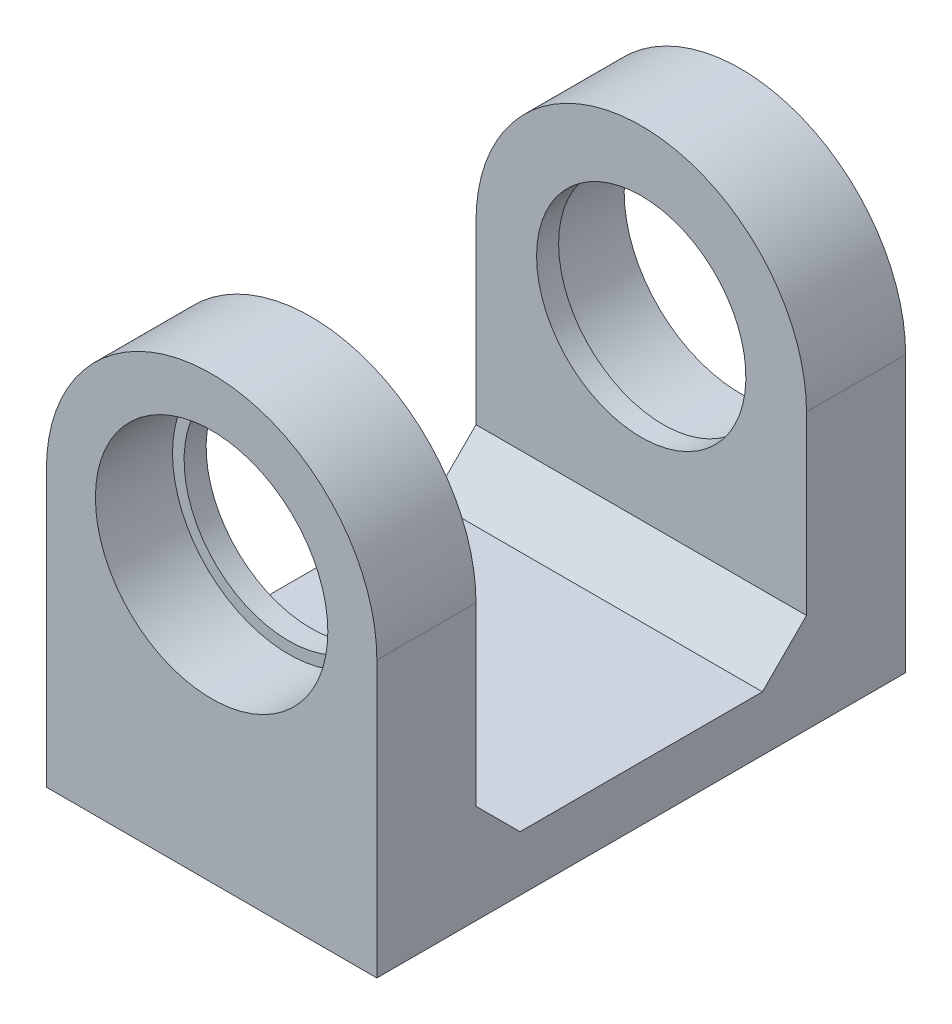
ISO-10303-21;
HEADER;
FILE_DESCRIPTION(('STEP AP214'),'2;1');
FILE_NAME('part.step','',(''),(''),'','','');
FILE_SCHEMA(('AUTOMOTIVE_DESIGN { 1 0 10303 214 1 1 1 1 }'));
ENDSEC;
DATA;
#1=APPLICATION_CONTEXT('core data for automotive mechanical design processes');
#2=APPLICATION_PROTOCOL_DEFINITION('international standard','automotive_design',2000,#1);
#3=PRODUCT_CONTEXT('',#1,'mechanical');
#4=PRODUCT('Part','Part','',(#3));
#5=PRODUCT_RELATED_PRODUCT_CATEGORY('part','',(#4));
#6=PRODUCT_DEFINITION_FORMATION('','',#4);
#7=PRODUCT_DEFINITION_CONTEXT('part definition',#1,'design');
#8=PRODUCT_DEFINITION('design','',#6,#7);
#9=PRODUCT_DEFINITION_SHAPE('','',#8);
#10=(LENGTH_UNIT() NAMED_UNIT(*) SI_UNIT(.MILLI.,.METRE.));
#11=(NAMED_UNIT(*) PLANE_ANGLE_UNIT() SI_UNIT($,.RADIAN.));
#12=(NAMED_UNIT(*) SI_UNIT($,.STERADIAN.) SOLID_ANGLE_UNIT());
#13=UNCERTAINTY_MEASURE_WITH_UNIT(LENGTH_MEASURE(1.E-05),#10,'distance_accuracy_value','');
#14=(GEOMETRIC_REPRESENTATION_CONTEXT(3) GLOBAL_UNCERTAINTY_ASSIGNED_CONTEXT((#13)) GLOBAL_UNIT_ASSIGNED_CONTEXT((#10,
#11,#12)) REPRESENTATION_CONTEXT('',''));
#15=CARTESIAN_POINT('',(0.,0.,0.));
#16=DIRECTION('',(0.,0.,1.));
#17=DIRECTION('',(1.,0.,0.));
#18=AXIS2_PLACEMENT_3D('',#15,#16,#17);
#19=CARTESIAN_POINT('',(0.,0.,24.));
#20=DIRECTION('',(0.,0.,-1.));
#21=DIRECTION('',(-1.,0.,0.));
#22=AXIS2_PLACEMENT_3D('',#19,#20,#21);
#23=CYLINDRICAL_SURFACE('',#22,9.5);
#24=CARTESIAN_POINT('',(0.,0.,15.));
#25=DIRECTION('',(0.,0.,1.));
#26=DIRECTION('',(0.,-1.,0.));
#27=AXIS2_PLACEMENT_3D('',#24,#25,#26);
#28=CIRCLE('',#27,9.5);
#29=CARTESIAN_POINT('',(0.,-9.5,15.));
#30=VERTEX_POINT('',#29);
#31=EDGE_CURVE('E180',#30,#30,#28,.T.);
#32=ORIENTED_EDGE('',*,*,#31,.F.);
#33=EDGE_LOOP('',(#32));
#34=FACE_BOUND('',#33,.T.);
#35=CARTESIAN_POINT('',(0.,0.,17.));
#36=DIRECTION('',(0.,0.,1.));
#37=DIRECTION('',(1.,0.,0.));
#38=AXIS2_PLACEMENT_3D('',#35,#36,#37);
#39=CIRCLE('',#38,9.5);
#40=CARTESIAN_POINT('',(9.5,0.,17.));
#41=VERTEX_POINT('',#40);
#42=EDGE_CURVE('E42',#41,#41,#39,.T.);
#43=ORIENTED_EDGE('',*,*,#42,.T.);
#44=EDGE_LOOP('',(#43));
#45=FACE_BOUND('',#44,.T.);
#46=ADVANCED_FACE('F38',(#34,#45),#23,.F.);
#47=CARTESIAN_POINT('',(0.,0.,-15.));
#48=DIRECTION('',(0.,0.,-1.));
#49=DIRECTION('',(0.,1.,0.));
#50=AXIS2_PLACEMENT_3D('',#47,#48,#49);
#51=CIRCLE('',#50,9.5);
#52=CARTESIAN_POINT('',(0.,9.5,-15.));
#53=VERTEX_POINT('',#52);
#54=EDGE_CURVE('E184',#53,#53,#51,.T.);
#55=ORIENTED_EDGE('',*,*,#54,.F.);
#56=EDGE_LOOP('',(#55));
#57=FACE_BOUND('',#56,.T.);
#58=CARTESIAN_POINT('',(0.,0.,-17.));
#59=DIRECTION('',(0.,0.,-1.));
#60=DIRECTION('',(-1.,0.,0.));
#61=AXIS2_PLACEMENT_3D('',#58,#59,#60);
#62=CIRCLE('',#61,9.5);
#63=CARTESIAN_POINT('',(-9.5,0.,-17.));
#64=VERTEX_POINT('',#63);
#65=EDGE_CURVE('E163',#64,#64,#62,.T.);
#66=ORIENTED_EDGE('',*,*,#65,.T.);
#67=EDGE_LOOP('',(#66));
#68=FACE_BOUND('',#67,.T.);
#69=ADVANCED_FACE('F284',(#57,#68),#23,.F.);
#70=CARTESIAN_POINT('',(0.,0.,24.));
#71=DIRECTION('',(0.,0.,-1.));
#72=DIRECTION('',(-1.,0.,0.));
#73=AXIS2_PLACEMENT_3D('',#70,#71,#72);
#74=CYLINDRICAL_SURFACE('',#73,15.);
#75=DIRECTION('',(0.,0.,-1.));
#76=VECTOR('',#75,1.);
#77=CARTESIAN_POINT('',(-15.,0.,24.));
#78=LINE('',#77,#76);
#79=CARTESIAN_POINT('',(-15.,0.,-15.));
#80=VERTEX_POINT('',#79);
#81=CARTESIAN_POINT('',(-15.,0.,-24.));
#82=VERTEX_POINT('',#81);
#83=EDGE_CURVE('E213',#80,#82,#78,.T.);
#84=ORIENTED_EDGE('',*,*,#83,.F.);
#85=CARTESIAN_POINT('',(0.,0.,-15.));
#86=DIRECTION('',(0.,0.,-1.));
#87=DIRECTION('',(0.,1.,0.));
#88=AXIS2_PLACEMENT_3D('',#85,#86,#87);
#89=CIRCLE('',#88,15.);
#90=CARTESIAN_POINT('',(15.,0.,-15.));
#91=VERTEX_POINT('',#90);
#92=EDGE_CURVE('E185',#80,#91,#89,.T.);
#93=ORIENTED_EDGE('',*,*,#92,.T.);
#94=DIRECTION('',(0.,0.,-1.));
#95=VECTOR('',#94,1.);
#96=CARTESIAN_POINT('',(15.,0.,24.));
#97=LINE('',#96,#95);
#98=CARTESIAN_POINT('',(15.,0.,-24.));
#99=VERTEX_POINT('',#98);
#100=EDGE_CURVE('E217',#91,#99,#97,.T.);
#101=ORIENTED_EDGE('',*,*,#100,.T.);
#102=CARTESIAN_POINT('',(0.,0.,-24.));
#103=DIRECTION('',(0.,0.,1.));
#104=DIRECTION('',(1.,0.,0.));
#105=AXIS2_PLACEMENT_3D('',#102,#103,#104);
#106=CIRCLE('',#105,15.);
#107=EDGE_CURVE('E202',#99,#82,#106,.T.);
#108=ORIENTED_EDGE('',*,*,#107,.T.);
#109=EDGE_LOOP('',(#84,#93,#101,#108));
#110=FACE_BOUND('',#109,.T.);
#111=ADVANCED_FACE('F282',(#110),#74,.T.);
#112=CARTESIAN_POINT('',(0.,0.,24.));
#113=DIRECTION('',(0.,0.,1.));
#114=DIRECTION('',(1.,0.,0.));
#115=AXIS2_PLACEMENT_3D('',#112,#113,#114);
#116=PLANE('',#115);
#117=CARTESIAN_POINT('',(0.,0.,24.));
#118=DIRECTION('',(0.,0.,-1.));
#119=DIRECTION('',(-1.,0.,0.));
#120=AXIS2_PLACEMENT_3D('',#117,#118,#119);
#121=CIRCLE('',#120,10.55);
#122=CARTESIAN_POINT('',(-10.55,0.,24.));
#123=VERTEX_POINT('',#122);
#124=EDGE_CURVE('E528',#123,#123,#121,.T.);
#125=ORIENTED_EDGE('',*,*,#124,.T.);
#126=EDGE_LOOP('',(#125));
#127=FACE_BOUND('',#126,.T.);
#128=DIRECTION('',(0.,1.,0.));
#129=VECTOR('',#128,1.);
#130=CARTESIAN_POINT('',(15.,-25.,24.));
#131=LINE('',#130,#129);
#132=CARTESIAN_POINT('',(15.,-25.,24.));
#133=VERTEX_POINT('',#132);
#134=CARTESIAN_POINT('',(15.,0.,24.));
#135=VERTEX_POINT('',#134);
#136=EDGE_CURVE('E189',#133,#135,#131,.T.);
#137=ORIENTED_EDGE('',*,*,#136,.T.);
#138=CARTESIAN_POINT('',(0.,0.,24.));
#139=DIRECTION('',(0.,0.,1.));
#140=DIRECTION('',(1.,0.,0.));
#141=AXIS2_PLACEMENT_3D('',#138,#139,#140);
#142=CIRCLE('',#141,15.);
#143=CARTESIAN_POINT('',(-15.,0.,24.));
#144=VERTEX_POINT('',#143);
#145=EDGE_CURVE('E192',#135,#144,#142,.T.);
#146=ORIENTED_EDGE('',*,*,#145,.T.);
#147=DIRECTION('',(0.,-1.,0.));
#148=VECTOR('',#147,1.);
#149=CARTESIAN_POINT('',(-15.,-25.,24.));
#150=LINE('',#149,#148);
#151=CARTESIAN_POINT('',(-15.,-25.,24.));
#152=VERTEX_POINT('',#151);
#153=EDGE_CURVE('E195',#144,#152,#150,.T.);
#154=ORIENTED_EDGE('',*,*,#153,.T.);
#155=DIRECTION('',(1.,0.,0.));
#156=VECTOR('',#155,1.);
#157=CARTESIAN_POINT('',(-15.,-25.,24.));
#158=LINE('',#157,#156);
#159=EDGE_CURVE('E197',#152,#133,#158,.T.);
#160=ORIENTED_EDGE('',*,*,#159,.T.);
#161=EDGE_LOOP('',(#137,#146,#154,#160));
#162=FACE_BOUND('',#161,.T.);
#163=ADVANCED_FACE('F271',(#127,#162),#116,.T.);
#164=CARTESIAN_POINT('',(0.,0.,-24.));
#165=DIRECTION('',(0.,0.,1.));
#166=DIRECTION('',(1.,0.,0.));
#167=AXIS2_PLACEMENT_3D('',#164,#165,#166);
#168=PLANE('',#167);
#169=CARTESIAN_POINT('',(0.,0.,-24.));
#170=DIRECTION('',(0.,0.,-1.));
#171=DIRECTION('',(-1.,0.,0.));
#172=AXIS2_PLACEMENT_3D('',#169,#170,#171);
#173=CIRCLE('',#172,10.55);
#174=CARTESIAN_POINT('',(-10.55,0.,-24.));
#175=VERTEX_POINT('',#174);
#176=EDGE_CURVE('E159',#175,#175,#173,.T.);
#177=ORIENTED_EDGE('',*,*,#176,.F.);
#178=EDGE_LOOP('',(#177));
#179=FACE_BOUND('',#178,.T.);
#180=DIRECTION('',(0.,1.,0.));
#181=VECTOR('',#180,1.);
#182=CARTESIAN_POINT('',(15.,-25.,-24.));
#183=LINE('',#182,#181);
#184=CARTESIAN_POINT('',(15.,-25.,-24.));
#185=VERTEX_POINT('',#184);
#186=EDGE_CURVE('E188',#185,#99,#183,.T.);
#187=ORIENTED_EDGE('',*,*,#186,.F.);
#188=DIRECTION('',(1.,0.,0.));
#189=VECTOR('',#188,1.);
#190=CARTESIAN_POINT('',(-15.,-25.,-24.));
#191=LINE('',#190,#189);
#192=CARTESIAN_POINT('',(-15.,-25.,-24.));
#193=VERTEX_POINT('',#192);
#194=EDGE_CURVE('E193',#193,#185,#191,.T.);
#195=ORIENTED_EDGE('',*,*,#194,.F.);
#196=DIRECTION('',(0.,-1.,0.));
#197=VECTOR('',#196,1.);
#198=CARTESIAN_POINT('',(-15.,-25.,-24.));
#199=LINE('',#198,#197);
#200=EDGE_CURVE('E205',#82,#193,#199,.T.);
#201=ORIENTED_EDGE('',*,*,#200,.F.);
#202=ORIENTED_EDGE('',*,*,#107,.F.);
#203=EDGE_LOOP('',(#187,#195,#201,#202));
#204=FACE_BOUND('',#203,.T.);
#205=ADVANCED_FACE('F279',(#179,#204),#168,.F.);
#206=CARTESIAN_POINT('',(15.,-25.,24.));
#207=DIRECTION('',(-1.,0.,0.));
#208=DIRECTION('',(0.,-1.,0.));
#209=AXIS2_PLACEMENT_3D('',#206,#207,#208);
#210=PLANE('',#209);
#211=ORIENTED_EDGE('',*,*,#100,.F.);
#212=DIRECTION('',(0.,1.,0.));
#213=VECTOR('',#212,1.);
#214=CARTESIAN_POINT('',(15.,49.949963180842,-15.));
#215=LINE('',#214,#213);
#216=CARTESIAN_POINT('',(15.,-15.9999999999999,-15.));
#217=VERTEX_POINT('',#216);
#218=EDGE_CURVE('E166',#217,#91,#215,.T.);
#219=ORIENTED_EDGE('',*,*,#218,.F.);
#220=DIRECTION('',(0.,0.707106781186551,-0.707106781186544));
#221=VECTOR('',#220,1.);
#222=CARTESIAN_POINT('',(15.,-40.,8.99999999999982));
#223=LINE('',#222,#221);
#224=CARTESIAN_POINT('',(15.,-20.,-11.));
#225=VERTEX_POINT('',#224);
#226=EDGE_CURVE('E236',#217,#225,#223,.F.);
#227=ORIENTED_EDGE('',*,*,#226,.T.);
#228=DIRECTION('',(0.,0.,-1.));
#229=VECTOR('',#228,1.);
#230=CARTESIAN_POINT('',(15.,-20.,15.));
#231=LINE('',#230,#229);
#232=CARTESIAN_POINT('',(15.,-20.,11.));
#233=VERTEX_POINT('',#232);
#234=EDGE_CURVE('E170',#233,#225,#231,.T.);
#235=ORIENTED_EDGE('',*,*,#234,.F.);
#236=DIRECTION('',(0.,-0.707106781186544,-0.707106781186551));
#237=VECTOR('',#236,1.);
#238=CARTESIAN_POINT('',(15.,-16.,15.));
#239=LINE('',#238,#237);
#240=CARTESIAN_POINT('',(15.,-16.,15.));
#241=VERTEX_POINT('',#240);
#242=EDGE_CURVE('E47',#233,#241,#239,.F.);
#243=ORIENTED_EDGE('',*,*,#242,.T.);
#244=DIRECTION('',(0.,-1.,0.));
#245=VECTOR('',#244,1.);
#246=CARTESIAN_POINT('',(15.,49.949963180842,15.));
#247=LINE('',#246,#245);
#248=CARTESIAN_POINT('',(15.,0.,15.));
#249=VERTEX_POINT('',#248);
#250=EDGE_CURVE('E168',#249,#241,#247,.T.);
#251=ORIENTED_EDGE('',*,*,#250,.F.);
#252=EDGE_CURVE('E218',#135,#249,#97,.T.);
#253=ORIENTED_EDGE('',*,*,#252,.F.);
#254=ORIENTED_EDGE('',*,*,#136,.F.);
#255=DIRECTION('',(0.,0.,-1.));
#256=VECTOR('',#255,1.);
#257=CARTESIAN_POINT('',(15.,-25.,24.));
#258=LINE('',#257,#256);
#259=EDGE_CURVE('E199',#133,#185,#258,.T.);
#260=ORIENTED_EDGE('',*,*,#259,.T.);
#261=ORIENTED_EDGE('',*,*,#186,.T.);
#262=EDGE_LOOP('',(#211,#219,#227,#235,#243,#251,#253,#254,#260,#261));
#263=FACE_BOUND('',#262,.T.);
#264=ADVANCED_FACE('F255',(#263),#210,.F.);
#265=ORIENTED_EDGE('',*,*,#252,.T.);
#266=CARTESIAN_POINT('',(0.,0.,15.));
#267=DIRECTION('',(0.,0.,1.));
#268=DIRECTION('',(0.,-1.,0.));
#269=AXIS2_PLACEMENT_3D('',#266,#267,#268);
#270=CIRCLE('',#269,15.);
#271=CARTESIAN_POINT('',(-15.,0.,15.));
#272=VERTEX_POINT('',#271);
#273=EDGE_CURVE('E181',#249,#272,#270,.T.);
#274=ORIENTED_EDGE('',*,*,#273,.T.);
#275=EDGE_CURVE('E214',#144,#272,#78,.T.);
#276=ORIENTED_EDGE('',*,*,#275,.F.);
#277=ORIENTED_EDGE('',*,*,#145,.F.);
#278=EDGE_LOOP('',(#265,#274,#276,#277));
#279=FACE_BOUND('',#278,.T.);
#280=ADVANCED_FACE('F265',(#279),#74,.T.);
#281=CARTESIAN_POINT('',(-15.,-25.,24.));
#282=DIRECTION('',(1.,0.,0.));
#283=DIRECTION('',(0.,0.,-1.));
#284=AXIS2_PLACEMENT_3D('',#281,#282,#283);
#285=PLANE('',#284);
#286=DIRECTION('',(0.,-1.,0.));
#287=VECTOR('',#286,1.);
#288=CARTESIAN_POINT('',(-15.,49.949963180842,15.));
#289=LINE('',#288,#287);
#290=CARTESIAN_POINT('',(-15.,-16.,15.));
#291=VERTEX_POINT('',#290);
#292=EDGE_CURVE('E175',#272,#291,#289,.T.);
#293=ORIENTED_EDGE('',*,*,#292,.T.);
#294=DIRECTION('',(0.,0.707106781186544,0.707106781186551));
#295=VECTOR('',#294,1.);
#296=CARTESIAN_POINT('',(-15.,-16.,15.));
#297=LINE('',#296,#295);
#298=CARTESIAN_POINT('',(-15.,-20.,11.));
#299=VERTEX_POINT('',#298);
#300=EDGE_CURVE('E11',#291,#299,#297,.F.);
#301=ORIENTED_EDGE('',*,*,#300,.T.);
#302=DIRECTION('',(0.,0.,-1.));
#303=VECTOR('',#302,1.);
#304=CARTESIAN_POINT('',(-15.,-20.,15.));
#305=LINE('',#304,#303);
#306=CARTESIAN_POINT('',(-15.,-20.,-11.));
#307=VERTEX_POINT('',#306);
#308=EDGE_CURVE('E177',#299,#307,#305,.T.);
#309=ORIENTED_EDGE('',*,*,#308,.T.);
#310=DIRECTION('',(0.,-0.707106781186551,0.707106781186544));
#311=VECTOR('',#310,1.);
#312=CARTESIAN_POINT('',(-15.,-40.,8.99999999999982));
#313=LINE('',#312,#311);
#314=CARTESIAN_POINT('',(-15.,-15.9999999999999,-15.));
#315=VERTEX_POINT('',#314);
#316=EDGE_CURVE('E238',#307,#315,#313,.F.);
#317=ORIENTED_EDGE('',*,*,#316,.T.);
#318=DIRECTION('',(0.,1.,0.));
#319=VECTOR('',#318,1.);
#320=CARTESIAN_POINT('',(-15.,49.949963180842,-15.));
#321=LINE('',#320,#319);
#322=EDGE_CURVE('E173',#315,#80,#321,.T.);
#323=ORIENTED_EDGE('',*,*,#322,.T.);
#324=ORIENTED_EDGE('',*,*,#83,.T.);
#325=ORIENTED_EDGE('',*,*,#200,.T.);
#326=DIRECTION('',(0.,0.,-1.));
#327=VECTOR('',#326,1.);
#328=CARTESIAN_POINT('',(-15.,-25.,24.));
#329=LINE('',#328,#327);
#330=EDGE_CURVE('E210',#152,#193,#329,.T.);
#331=ORIENTED_EDGE('',*,*,#330,.F.);
#332=ORIENTED_EDGE('',*,*,#153,.F.);
#333=ORIENTED_EDGE('',*,*,#275,.T.);
#334=EDGE_LOOP('',(#293,#301,#309,#317,#323,#324,#325,#331,#332,#333));
#335=FACE_BOUND('',#334,.T.);
#336=ADVANCED_FACE('F243',(#335),#285,.F.);
#337=CARTESIAN_POINT('',(-15.,-25.,24.));
#338=DIRECTION('',(0.,1.,0.));
#339=DIRECTION('',(0.,0.,1.));
#340=AXIS2_PLACEMENT_3D('',#337,#338,#339);
#341=PLANE('',#340);
#342=CARTESIAN_POINT('',(-9.,-25.,19.));
#343=DIRECTION('',(0.,-1.,0.));
#344=DIRECTION('',(0.,0.,-1.));
#345=AXIS2_PLACEMENT_3D('',#342,#343,#344);
#346=CIRCLE('',#345,1.24999999999999);
#347=CARTESIAN_POINT('',(-9.,-25.,17.75));
#348=VERTEX_POINT('',#347);
#349=EDGE_CURVE('E136',#348,#348,#346,.T.);
#350=ORIENTED_EDGE('',*,*,#349,.F.);
#351=EDGE_LOOP('',(#350));
#352=FACE_BOUND('',#351,.T.);
#353=CARTESIAN_POINT('',(9.,-25.,19.));
#354=DIRECTION('',(0.,-1.,0.));
#355=DIRECTION('',(0.,0.,-1.));
#356=AXIS2_PLACEMENT_3D('',#353,#354,#355);
#357=CIRCLE('',#356,1.24999999999999);
#358=CARTESIAN_POINT('',(9.,-25.,17.75));
#359=VERTEX_POINT('',#358);
#360=EDGE_CURVE('E135',#359,#359,#357,.T.);
#361=ORIENTED_EDGE('',*,*,#360,.F.);
#362=EDGE_LOOP('',(#361));
#363=FACE_BOUND('',#362,.T.);
#364=CARTESIAN_POINT('',(-9.,-25.,-19.));
#365=DIRECTION('',(0.,-1.,0.));
#366=DIRECTION('',(0.,0.,-1.));
#367=AXIS2_PLACEMENT_3D('',#364,#365,#366);
#368=CIRCLE('',#367,1.24999999999999);
#369=CARTESIAN_POINT('',(-9.,-25.,-20.25));
#370=VERTEX_POINT('',#369);
#371=EDGE_CURVE('E147',#370,#370,#368,.T.);
#372=ORIENTED_EDGE('',*,*,#371,.F.);
#373=EDGE_LOOP('',(#372));
#374=FACE_BOUND('',#373,.T.);
#375=CARTESIAN_POINT('',(9.,-25.,-19.));
#376=DIRECTION('',(0.,-1.,0.));
#377=DIRECTION('',(0.,0.,-1.));
#378=AXIS2_PLACEMENT_3D('',#375,#376,#377);
#379=CIRCLE('',#378,1.24999999999999);
#380=CARTESIAN_POINT('',(9.,-25.,-20.25));
#381=VERTEX_POINT('',#380);
#382=EDGE_CURVE('E153',#381,#381,#379,.T.);
#383=ORIENTED_EDGE('',*,*,#382,.F.);
#384=EDGE_LOOP('',(#383));
#385=FACE_BOUND('',#384,.T.);
#386=ORIENTED_EDGE('',*,*,#194,.T.);
#387=ORIENTED_EDGE('',*,*,#259,.F.);
#388=ORIENTED_EDGE('',*,*,#159,.F.);
#389=ORIENTED_EDGE('',*,*,#330,.T.);
#390=EDGE_LOOP('',(#386,#387,#388,#389));
#391=FACE_BOUND('',#390,.T.);
#392=ADVANCED_FACE('F275',(#352,#363,#374,#385,#391),#341,.F.);
#393=CARTESIAN_POINT('',(-15.,49.949963180842,-15.));
#394=DIRECTION('',(0.,0.,-1.));
#395=DIRECTION('',(0.,1.,0.));
#396=AXIS2_PLACEMENT_3D('',#393,#394,#395);
#397=PLANE('',#396);
#398=ORIENTED_EDGE('',*,*,#54,.T.);
#399=EDGE_LOOP('',(#398));
#400=FACE_BOUND('',#399,.T.);
#401=ORIENTED_EDGE('',*,*,#322,.F.);
#402=DIRECTION('',(1.,0.,0.));
#403=VECTOR('',#402,1.);
#404=CARTESIAN_POINT('',(15.,-16.,-15.));
#405=LINE('',#404,#403);
#406=EDGE_CURVE('E221',#315,#217,#405,.T.);
#407=ORIENTED_EDGE('',*,*,#406,.T.);
#408=ORIENTED_EDGE('',*,*,#218,.T.);
#409=ORIENTED_EDGE('',*,*,#92,.F.);
#410=EDGE_LOOP('',(#401,#407,#408,#409));
#411=FACE_BOUND('',#410,.T.);
#412=ADVANCED_FACE('F250',(#400,#411),#397,.F.);
#413=CARTESIAN_POINT('',(-15.,49.949963180842,15.));
#414=DIRECTION('',(0.,0.,1.));
#415=DIRECTION('',(0.,-1.,0.));
#416=AXIS2_PLACEMENT_3D('',#413,#414,#415);
#417=PLANE('',#416);
#418=ORIENTED_EDGE('',*,*,#31,.T.);
#419=EDGE_LOOP('',(#418));
#420=FACE_BOUND('',#419,.T.);
#421=ORIENTED_EDGE('',*,*,#250,.T.);
#422=DIRECTION('',(-1.,0.,0.));
#423=VECTOR('',#422,1.);
#424=CARTESIAN_POINT('',(-15.,-16.,15.));
#425=LINE('',#424,#423);
#426=EDGE_CURVE('E54',#241,#291,#425,.T.);
#427=ORIENTED_EDGE('',*,*,#426,.T.);
#428=ORIENTED_EDGE('',*,*,#292,.F.);
#429=ORIENTED_EDGE('',*,*,#273,.F.);
#430=EDGE_LOOP('',(#421,#427,#428,#429));
#431=FACE_BOUND('',#430,.T.);
#432=ADVANCED_FACE('F263',(#420,#431),#417,.F.);
#433=CARTESIAN_POINT('',(-15.,-20.,15.));
#434=DIRECTION('',(0.,-1.,0.));
#435=DIRECTION('',(0.,0.,-1.));
#436=AXIS2_PLACEMENT_3D('',#433,#434,#435);
#437=PLANE('',#436);
#438=ORIENTED_EDGE('',*,*,#234,.T.);
#439=DIRECTION('',(-1.,0.,0.));
#440=VECTOR('',#439,1.);
#441=CARTESIAN_POINT('',(-15.,-20.,-11.));
#442=LINE('',#441,#440);
#443=EDGE_CURVE('E233',#225,#307,#442,.T.);
#444=ORIENTED_EDGE('',*,*,#443,.T.);
#445=ORIENTED_EDGE('',*,*,#308,.F.);
#446=DIRECTION('',(1.,0.,0.));
#447=VECTOR('',#446,1.);
#448=CARTESIAN_POINT('',(15.,-20.,11.));
#449=LINE('',#448,#447);
#450=EDGE_CURVE('E230',#299,#233,#449,.T.);
#451=ORIENTED_EDGE('',*,*,#450,.T.);
#452=EDGE_LOOP('',(#438,#444,#445,#451));
#453=FACE_BOUND('',#452,.T.);
#454=ADVANCED_FACE('F257',(#453),#437,.F.);
#455=CARTESIAN_POINT('',(0.,0.,-17.));
#456=DIRECTION('',(0.,0.,-1.));
#457=DIRECTION('',(-1.,0.,0.));
#458=AXIS2_PLACEMENT_3D('',#455,#456,#457);
#459=CYLINDRICAL_SURFACE('',#458,10.55);
#460=CARTESIAN_POINT('',(0.,0.,-17.));
#461=DIRECTION('',(0.,0.,-1.));
#462=DIRECTION('',(-1.,0.,0.));
#463=AXIS2_PLACEMENT_3D('',#460,#461,#462);
#464=CIRCLE('',#463,10.55);
#465=CARTESIAN_POINT('',(-10.55,0.,-17.));
#466=VERTEX_POINT('',#465);
#467=EDGE_CURVE('E160',#466,#466,#464,.T.);
#468=ORIENTED_EDGE('',*,*,#467,.F.);
#469=EDGE_LOOP('',(#468));
#470=FACE_BOUND('',#469,.T.);
#471=ORIENTED_EDGE('',*,*,#176,.T.);
#472=EDGE_LOOP('',(#471));
#473=FACE_BOUND('',#472,.T.);
#474=ADVANCED_FACE('F342',(#470,#473),#459,.F.);
#475=CARTESIAN_POINT('',(0.,0.,-17.));
#476=DIRECTION('',(0.,0.,-1.));
#477=DIRECTION('',(-1.,0.,0.));
#478=AXIS2_PLACEMENT_3D('',#475,#476,#477);
#479=PLANE('',#478);
#480=ORIENTED_EDGE('',*,*,#65,.F.);
#481=EDGE_LOOP('',(#480));
#482=FACE_BOUND('',#481,.T.);
#483=ORIENTED_EDGE('',*,*,#467,.T.);
#484=EDGE_LOOP('',(#483));
#485=FACE_BOUND('',#484,.T.);
#486=ADVANCED_FACE('F350',(#482,#485),#479,.T.);
#487=CARTESIAN_POINT('',(-15.,-16.,-15.));
#488=DIRECTION('',(0.,0.707106781186544,0.707106781186551));
#489=DIRECTION('',(-1.,0.,0.));
#490=AXIS2_PLACEMENT_3D('',#487,#488,#489);
#491=PLANE('',#490);
#492=ORIENTED_EDGE('',*,*,#316,.F.);
#493=ORIENTED_EDGE('',*,*,#443,.F.);
#494=ORIENTED_EDGE('',*,*,#226,.F.);
#495=ORIENTED_EDGE('',*,*,#406,.F.);
#496=EDGE_LOOP('',(#492,#493,#494,#495));
#497=FACE_BOUND('',#496,.T.);
#498=ADVANCED_FACE('F253',(#497),#491,.T.);
#499=CARTESIAN_POINT('',(-15.,-20.,11.));
#500=DIRECTION('',(0.,0.707106781186551,-0.707106781186544));
#501=DIRECTION('',(-1.,0.,0.));
#502=AXIS2_PLACEMENT_3D('',#499,#500,#501);
#503=PLANE('',#502);
#504=ORIENTED_EDGE('',*,*,#300,.F.);
#505=ORIENTED_EDGE('',*,*,#426,.F.);
#506=ORIENTED_EDGE('',*,*,#242,.F.);
#507=ORIENTED_EDGE('',*,*,#450,.F.);
#508=EDGE_LOOP('',(#504,#505,#506,#507));
#509=FACE_BOUND('',#508,.T.);
#510=ADVANCED_FACE('F40',(#509),#503,.T.);
#511=CARTESIAN_POINT('',(9.,-15.,-19.));
#512=DIRECTION('',(0.,-1.,0.));
#513=DIRECTION('',(0.,0.,-1.));
#514=AXIS2_PLACEMENT_3D('',#511,#512,#513);
#515=CONICAL_SURFACE('',#514,1.25,1.02974425867665);
#516=CARTESIAN_POINT('',(9.,-14.2489242262155,-19.));
#517=VERTEX_POINT('',#516);
#518=VERTEX_LOOP('',#517);
#519=FACE_BOUND('',#518,.T.);
#520=CARTESIAN_POINT('',(9.,-15.,-19.));
#521=DIRECTION('',(0.,-1.,0.));
#522=DIRECTION('',(0.,0.,-1.));
#523=AXIS2_PLACEMENT_3D('',#520,#521,#522);
#524=CIRCLE('',#523,1.25);
#525=CARTESIAN_POINT('',(9.,-15.,-20.25));
#526=VERTEX_POINT('',#525);
#527=EDGE_CURVE('E156',#526,#526,#524,.T.);
#528=ORIENTED_EDGE('',*,*,#527,.T.);
#529=EDGE_LOOP('',(#528));
#530=FACE_BOUND('',#529,.T.);
#531=ADVANCED_FACE('F369',(#519,#530),#515,.F.);
#532=CARTESIAN_POINT('',(9.,-25.,-19.));
#533=DIRECTION('',(0.,-1.,0.));
#534=DIRECTION('',(0.,0.,-1.));
#535=AXIS2_PLACEMENT_3D('',#532,#533,#534);
#536=CYLINDRICAL_SURFACE('',#535,1.24999999999999);
#537=ORIENTED_EDGE('',*,*,#527,.F.);
#538=EDGE_LOOP('',(#537));
#539=FACE_BOUND('',#538,.T.);
#540=ORIENTED_EDGE('',*,*,#382,.T.);
#541=EDGE_LOOP('',(#540));
#542=FACE_BOUND('',#541,.T.);
#543=ADVANCED_FACE('F374',(#539,#542),#536,.F.);
#544=CARTESIAN_POINT('',(-9.,-15.,-19.));
#545=DIRECTION('',(0.,-1.,0.));
#546=DIRECTION('',(0.,0.,-1.));
#547=AXIS2_PLACEMENT_3D('',#544,#545,#546);
#548=CONICAL_SURFACE('',#547,1.25,1.02974425867665);
#549=CARTESIAN_POINT('',(-9.,-14.2489242262155,-19.));
#550=VERTEX_POINT('',#549);
#551=VERTEX_LOOP('',#550);
#552=FACE_BOUND('',#551,.T.);
#553=CARTESIAN_POINT('',(-9.,-15.,-19.));
#554=DIRECTION('',(0.,-1.,0.));
#555=DIRECTION('',(0.,0.,-1.));
#556=AXIS2_PLACEMENT_3D('',#553,#554,#555);
#557=CIRCLE('',#556,1.25);
#558=CARTESIAN_POINT('',(-9.,-15.,-20.25));
#559=VERTEX_POINT('',#558);
#560=EDGE_CURVE('E150',#559,#559,#557,.T.);
#561=ORIENTED_EDGE('',*,*,#560,.T.);
#562=EDGE_LOOP('',(#561));
#563=FACE_BOUND('',#562,.T.);
#564=ADVANCED_FACE('F383',(#552,#563),#548,.F.);
#565=CARTESIAN_POINT('',(-9.,-25.,-19.));
#566=DIRECTION('',(0.,-1.,0.));
#567=DIRECTION('',(0.,0.,-1.));
#568=AXIS2_PLACEMENT_3D('',#565,#566,#567);
#569=CYLINDRICAL_SURFACE('',#568,1.24999999999999);
#570=ORIENTED_EDGE('',*,*,#560,.F.);
#571=EDGE_LOOP('',(#570));
#572=FACE_BOUND('',#571,.T.);
#573=ORIENTED_EDGE('',*,*,#371,.T.);
#574=EDGE_LOOP('',(#573));
#575=FACE_BOUND('',#574,.T.);
#576=ADVANCED_FACE('F391',(#572,#575),#569,.F.);
#577=CARTESIAN_POINT('',(9.,-15.,19.));
#578=DIRECTION('',(0.,-1.,0.));
#579=DIRECTION('',(0.,0.,-1.));
#580=AXIS2_PLACEMENT_3D('',#577,#578,#579);
#581=CONICAL_SURFACE('',#580,1.25,1.02974425867665);
#582=CARTESIAN_POINT('',(9.,-14.2489242262155,19.));
#583=VERTEX_POINT('',#582);
#584=VERTEX_LOOP('',#583);
#585=FACE_BOUND('',#584,.T.);
#586=CARTESIAN_POINT('',(9.,-15.,19.));
#587=DIRECTION('',(0.,-1.,0.));
#588=DIRECTION('',(0.,0.,-1.));
#589=AXIS2_PLACEMENT_3D('',#586,#587,#588);
#590=CIRCLE('',#589,1.25);
#591=CARTESIAN_POINT('',(9.,-15.,17.75));
#592=VERTEX_POINT('',#591);
#593=EDGE_CURVE('E139',#592,#592,#590,.T.);
#594=ORIENTED_EDGE('',*,*,#593,.T.);
#595=EDGE_LOOP('',(#594));
#596=FACE_BOUND('',#595,.T.);
#597=ADVANCED_FACE('F399',(#585,#596),#581,.F.);
#598=CARTESIAN_POINT('',(9.,-25.,19.));
#599=DIRECTION('',(0.,-1.,0.));
#600=DIRECTION('',(0.,0.,-1.));
#601=AXIS2_PLACEMENT_3D('',#598,#599,#600);
#602=CYLINDRICAL_SURFACE('',#601,1.24999999999999);
#603=ORIENTED_EDGE('',*,*,#593,.F.);
#604=EDGE_LOOP('',(#603));
#605=FACE_BOUND('',#604,.T.);
#606=ORIENTED_EDGE('',*,*,#360,.T.);
#607=EDGE_LOOP('',(#606));
#608=FACE_BOUND('',#607,.T.);
#609=ADVANCED_FACE('F129',(#605,#608),#602,.F.);
#610=CARTESIAN_POINT('',(-9.,-15.,19.));
#611=DIRECTION('',(0.,-1.,0.));
#612=DIRECTION('',(0.,0.,-1.));
#613=AXIS2_PLACEMENT_3D('',#610,#611,#612);
#614=CONICAL_SURFACE('',#613,1.25,1.02974425867665);
#615=CARTESIAN_POINT('',(-9.,-14.2489242262155,19.));
#616=VERTEX_POINT('',#615);
#617=VERTEX_LOOP('',#616);
#618=FACE_BOUND('',#617,.T.);
#619=CARTESIAN_POINT('',(-9.,-15.,19.));
#620=DIRECTION('',(0.,-1.,0.));
#621=DIRECTION('',(0.,0.,-1.));
#622=AXIS2_PLACEMENT_3D('',#619,#620,#621);
#623=CIRCLE('',#622,1.25);
#624=CARTESIAN_POINT('',(-9.,-15.,17.75));
#625=VERTEX_POINT('',#624);
#626=EDGE_CURVE('E133',#625,#625,#623,.T.);
#627=ORIENTED_EDGE('',*,*,#626,.T.);
#628=EDGE_LOOP('',(#627));
#629=FACE_BOUND('',#628,.T.);
#630=ADVANCED_FACE('F125',(#618,#629),#614,.F.);
#631=CARTESIAN_POINT('',(-9.,-25.,19.));
#632=DIRECTION('',(0.,-1.,0.));
#633=DIRECTION('',(0.,0.,-1.));
#634=AXIS2_PLACEMENT_3D('',#631,#632,#633);
#635=CYLINDRICAL_SURFACE('',#634,1.24999999999999);
#636=ORIENTED_EDGE('',*,*,#626,.F.);
#637=EDGE_LOOP('',(#636));
#638=FACE_BOUND('',#637,.T.);
#639=ORIENTED_EDGE('',*,*,#349,.T.);
#640=EDGE_LOOP('',(#639));
#641=FACE_BOUND('',#640,.T.);
#642=ADVANCED_FACE('F128',(#638,#641),#635,.F.);
#643=CARTESIAN_POINT('',(0.,0.,17.));
#644=DIRECTION('',(0.,0.,1.));
#645=DIRECTION('',(1.,0.,0.));
#646=AXIS2_PLACEMENT_3D('',#643,#644,#645);
#647=CYLINDRICAL_SURFACE('',#646,10.55);
#648=CARTESIAN_POINT('',(0.,0.,17.));
#649=DIRECTION('',(0.,0.,-1.));
#650=DIRECTION('',(-1.,0.,0.));
#651=AXIS2_PLACEMENT_3D('',#648,#649,#650);
#652=CIRCLE('',#651,10.55);
#653=CARTESIAN_POINT('',(-10.55,0.,17.));
#654=VERTEX_POINT('',#653);
#655=EDGE_CURVE('E527',#654,#654,#652,.T.);
#656=ORIENTED_EDGE('',*,*,#655,.T.);
#657=EDGE_LOOP('',(#656));
#658=FACE_BOUND('',#657,.T.);
#659=ORIENTED_EDGE('',*,*,#124,.F.);
#660=EDGE_LOOP('',(#659));
#661=FACE_BOUND('',#660,.T.);
#662=ADVANCED_FACE('F425',(#658,#661),#647,.F.);
#663=CARTESIAN_POINT('',(0.,0.,17.));
#664=DIRECTION('',(0.,0.,1.));
#665=DIRECTION('',(-1.,0.,0.));
#666=AXIS2_PLACEMENT_3D('',#663,#664,#665);
#667=PLANE('',#666);
#668=ORIENTED_EDGE('',*,*,#42,.F.);
#669=EDGE_LOOP('',(#668));
#670=FACE_BOUND('',#669,.T.);
#671=ORIENTED_EDGE('',*,*,#655,.F.);
#672=EDGE_LOOP('',(#671));
#673=FACE_BOUND('',#672,.T.);
#674=ADVANCED_FACE('F431',(#670,#673),#667,.T.);
#675=CLOSED_SHELL('',(#46,#69,#111,#163,#205,#264,#280,#336,#392,#412,#432,#454,#474,#486,#498,
#510,#531,#543,#564,#576,#597,#609,#630,#642,#662,#674));
#676=MANIFOLD_SOLID_BREP('B2',#675);
#677=ADVANCED_BREP_SHAPE_REPRESENTATION('',(#18,#676),#14);
#678=SHAPE_DEFINITION_REPRESENTATION(#9,#677);
ENDSEC;
END-ISO-10303-21;
